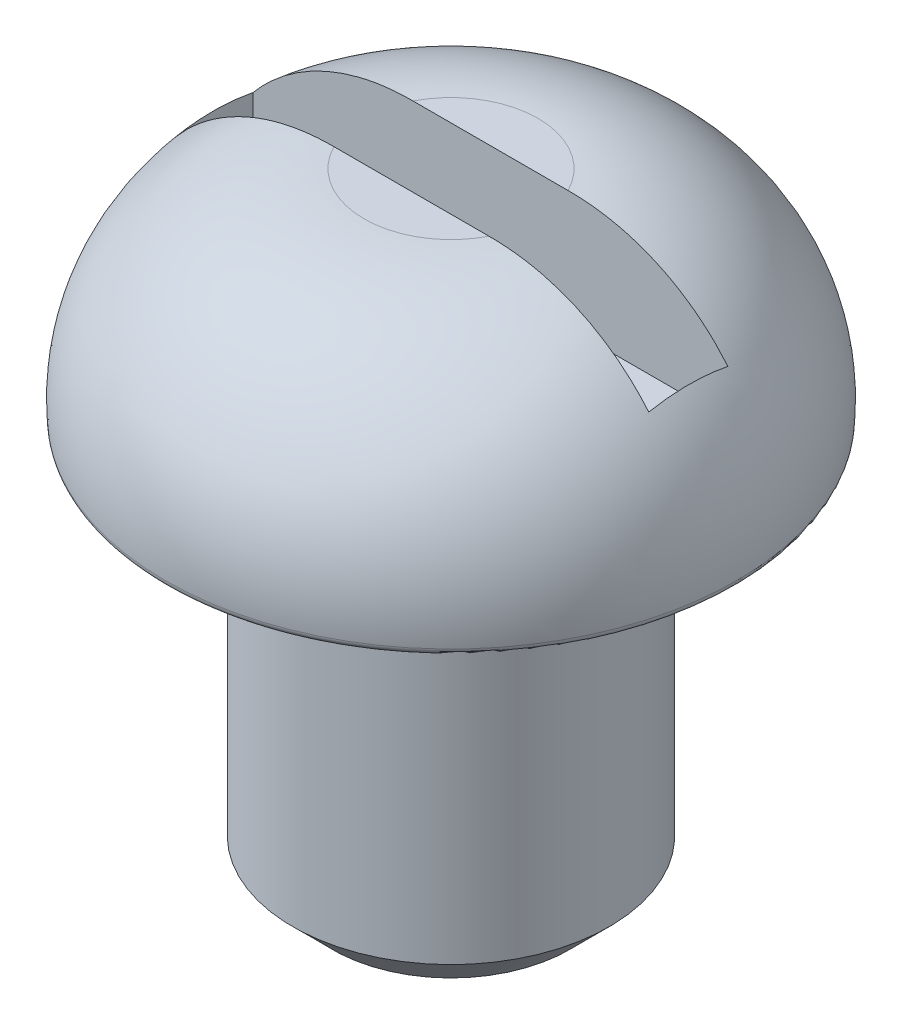
ISO-10303-21;
HEADER;
FILE_DESCRIPTION(('STEP AP214'),'2;1');
FILE_NAME('part.step','',(''),(''),'','','');
FILE_SCHEMA(('AUTOMOTIVE_DESIGN { 1 0 10303 214 1 1 1 1 }'));
ENDSEC;
DATA;
#1=APPLICATION_CONTEXT('core data for automotive mechanical design processes');
#2=APPLICATION_PROTOCOL_DEFINITION('international standard','automotive_design',2000,#1);
#3=PRODUCT_CONTEXT('',#1,'mechanical');
#4=PRODUCT('Part','Part','',(#3));
#5=PRODUCT_RELATED_PRODUCT_CATEGORY('part','',(#4));
#6=PRODUCT_DEFINITION_FORMATION('','',#4);
#7=PRODUCT_DEFINITION_CONTEXT('part definition',#1,'design');
#8=PRODUCT_DEFINITION('design','',#6,#7);
#9=PRODUCT_DEFINITION_SHAPE('','',#8);
#10=(LENGTH_UNIT() NAMED_UNIT(*) SI_UNIT(.MILLI.,.METRE.));
#11=(NAMED_UNIT(*) PLANE_ANGLE_UNIT() SI_UNIT($,.RADIAN.));
#12=(NAMED_UNIT(*) SI_UNIT($,.STERADIAN.) SOLID_ANGLE_UNIT());
#13=UNCERTAINTY_MEASURE_WITH_UNIT(LENGTH_MEASURE(1.E-05),#10,'distance_accuracy_value','');
#14=(GEOMETRIC_REPRESENTATION_CONTEXT(3) GLOBAL_UNCERTAINTY_ASSIGNED_CONTEXT((#13)) GLOBAL_UNIT_ASSIGNED_CONTEXT((#10,
#11,#12)) REPRESENTATION_CONTEXT('',''));
#15=CARTESIAN_POINT('',(0.,0.,0.));
#16=DIRECTION('',(0.,0.,1.));
#17=DIRECTION('',(1.,0.,0.));
#18=AXIS2_PLACEMENT_3D('',#15,#16,#17);
#19=CARTESIAN_POINT('',(0.,7.8,0.));
#20=DIRECTION('',(0.,1.,0.));
#21=DIRECTION('',(0.,0.,1.));
#22=AXIS2_PLACEMENT_3D('',#19,#20,#21);
#23=PLANE('',#22);
#24=DIRECTION('',(-1.,0.,0.));
#25=VECTOR('',#24,1.);
#26=CARTESIAN_POINT('',(-3.,7.8,-0.499999999999999));
#27=LINE('',#26,#25);
#28=CARTESIAN_POINT('',(0.979795897113272,7.8,-0.5));
#29=VERTEX_POINT('',#28);
#30=CARTESIAN_POINT('',(-0.979795897113272,7.8,-0.5));
#31=VERTEX_POINT('',#30);
#32=EDGE_CURVE('E105',#29,#31,#27,.T.);
#33=ORIENTED_EDGE('',*,*,#32,.F.);
#34=CARTESIAN_POINT('',(0.,7.8,0.));
#35=DIRECTION('',(0.,-1.,0.));
#36=DIRECTION('',(0.,0.,-1.));
#37=AXIS2_PLACEMENT_3D('',#34,#35,#36);
#38=CIRCLE('',#37,1.1);
#39=EDGE_CURVE('E128',#31,#29,#38,.T.);
#40=ORIENTED_EDGE('',*,*,#39,.F.);
#41=EDGE_LOOP('',(#33,#40));
#42=FACE_BOUND('',#41,.T.);
#43=ADVANCED_FACE('F29',(#42),#23,.T.);
#44=CARTESIAN_POINT('',(1.5,0.,0.));
#45=DIRECTION('',(0.,-1.,0.));
#46=DIRECTION('',(0.,0.,-1.));
#47=AXIS2_PLACEMENT_3D('',#44,#45,#46);
#48=PLANE('',#47);
#49=CARTESIAN_POINT('',(0.,0.,0.));
#50=DIRECTION('',(0.,-1.,0.));
#51=DIRECTION('',(0.,0.,-1.));
#52=AXIS2_PLACEMENT_3D('',#49,#50,#51);
#53=CIRCLE('',#52,1.5);
#54=CARTESIAN_POINT('',(0.,0.,-1.5));
#55=VERTEX_POINT('',#54);
#56=EDGE_CURVE('E115',#55,#55,#53,.T.);
#57=ORIENTED_EDGE('',*,*,#56,.T.);
#58=EDGE_LOOP('',(#57));
#59=FACE_BOUND('',#58,.T.);
#60=ADVANCED_FACE('F31',(#59),#48,.T.);
#61=DIRECTION('',(1.,0.,0.));
#62=VECTOR('',#61,1.);
#63=CARTESIAN_POINT('',(-3.,7.8,0.5));
#64=LINE('',#63,#62);
#65=CARTESIAN_POINT('',(-0.979795897113272,7.8,0.5));
#66=VERTEX_POINT('',#65);
#67=CARTESIAN_POINT('',(0.979795897113272,7.8,0.5));
#68=VERTEX_POINT('',#67);
#69=EDGE_CURVE('E107',#66,#68,#64,.T.);
#70=ORIENTED_EDGE('',*,*,#69,.F.);
#71=EDGE_CURVE('E131',#68,#66,#38,.T.);
#72=ORIENTED_EDGE('',*,*,#71,.F.);
#73=EDGE_LOOP('',(#70,#72));
#74=FACE_BOUND('',#73,.T.);
#75=ADVANCED_FACE('F176',(#74),#23,.T.);
#76=CARTESIAN_POINT('',(0.,5.28392857142857,0.));
#77=DIRECTION('',(0.,-1.,0.));
#78=DIRECTION('',(0.,0.,-1.));
#79=AXIS2_PLACEMENT_3D('',#76,#77,#78);
#80=DEGENERATE_TOROIDAL_SURFACE('',#79,1.1,2.51607142857143,.T.);
#81=CARTESIAN_POINT('',(0.,7.72741285287453,-0.5));
#82=CARTESIAN_POINT('',(-0.042281839216798,7.72741654693849,-0.5));
#83=CARTESIAN_POINT('',(-0.0845648077539234,7.72877327592071,-0.5));
#84=CARTESIAN_POINT('',(-0.16903295112575,7.73371678296004,-0.5));
#85=CARTESIAN_POINT('',(-0.211217957322735,7.73730612669833,-0.5));
#86=CARTESIAN_POINT('',(-0.295732319609198,7.74568730123717,-0.5));
#87=CARTESIAN_POINT('',(-0.338060855781322,7.75048672709458,-0.5));
#88=CARTESIAN_POINT('',(-0.42268796162483,7.76026727094819,-0.5));
#89=CARTESIAN_POINT('',(-0.464986535283327,7.7652483565223,-0.5));
#90=CARTESIAN_POINT('',(-0.549995859987487,7.77469082090246,-0.5));
#91=CARTESIAN_POINT('',(-0.592707150305704,7.77914761083377,-0.5));
#92=CARTESIAN_POINT('',(-0.678226998569677,7.78698758227835,-0.5));
#93=CARTESIAN_POINT('',(-0.721035552525858,7.79037080705423,-0.5));
#94=CARTESIAN_POINT('',(-0.84958950567168,7.79837652375647,-0.5));
#95=CARTESIAN_POINT('',(-0.935489790921104,7.80085850297676,-0.5));
#96=CARTESIAN_POINT('',(-1.1067831178282,7.7985979859046,-0.5));
#97=CARTESIAN_POINT('',(-1.19217649378594,7.7938926243803,-0.5));
#98=CARTESIAN_POINT('',(-1.36218346820903,7.7767110644375,-0.5));
#99=CARTESIAN_POINT('',(-1.44679694829237,7.76423370538063,-0.5));
#100=CARTESIAN_POINT('',(-1.67247179942634,7.71978857872035,-0.5));
#101=CARTESIAN_POINT('',(-1.81214349732275,7.68031086977517,-0.5));
#102=CARTESIAN_POINT('',(-2.08327243273732,7.578365307995,-0.5));
#103=CARTESIAN_POINT('',(-2.21470455040019,7.51583080489117,-0.5));
#104=CARTESIAN_POINT('',(-2.46503915559689,7.36922411758531,-0.5));
#105=CARTESIAN_POINT('',(-2.5839377708626,7.28514530456096,-0.499999999999999));
#106=CARTESIAN_POINT('',(-2.80538188060228,7.09787399130033,-0.499999999999999));
#107=CARTESIAN_POINT('',(-2.90794452018514,6.99470177942185,-0.499999999999999));
#108=CARTESIAN_POINT('',(-3.09164169034083,6.77468570273218,-0.499999999999999));
#109=CARTESIAN_POINT('',(-3.17320287222632,6.6581978139942,-0.499999999999999));
#110=CARTESIAN_POINT('',(-3.31544644584769,6.41305955169074,-0.499999999999999));
#111=CARTESIAN_POINT('',(-3.37612390334343,6.28440631293368,-0.499999999999999));
#112=CARTESIAN_POINT('',(-3.47437212103018,6.01976923720552,-0.499999999999999));
#113=CARTESIAN_POINT('',(-3.5121288252665,5.88385439630765,-0.499999999999999));
#114=CARTESIAN_POINT('',(-3.56421697913353,5.60762139502178,-0.499999999999999));
#115=CARTESIAN_POINT('',(-3.57855112578794,5.46730374349831,-0.499999999999999));
#116=CARTESIAN_POINT('',(-3.58337884124122,5.18663409871116,-0.499999999999999));
#117=CARTESIAN_POINT('',(-3.57393572471911,5.04628318963348,-0.499999999999999));
#118=CARTESIAN_POINT('',(-3.5316141639522,4.76915049513042,-0.499999999999999));
#119=CARTESIAN_POINT('',(-3.498734095655,4.63236895772385,-0.499999999999999));
#120=CARTESIAN_POINT('',(-3.41049285796513,4.36628210405101,-0.499999999999999));
#121=CARTESIAN_POINT('',(-3.35513462872845,4.23697581254436,-0.499999999999999));
#122=CARTESIAN_POINT('',(-3.22354867158706,3.98949328322027,-0.499999999999999));
#123=CARTESIAN_POINT('',(-3.14732499631139,3.87131489005098,-0.499999999999999));
#124=CARTESIAN_POINT('',(-2.97603829937548,3.64915027308459,-0.499999999999999));
#125=CARTESIAN_POINT('',(-2.88093963719999,3.54519153648646,-0.499999999999999));
#126=CARTESIAN_POINT('',(-2.67467710760851,3.35454114342512,-0.499999999999999));
#127=CARTESIAN_POINT('',(-2.56350398798273,3.26785950020401,-0.5));
#128=CARTESIAN_POINT('',(-2.32755014511485,3.11360464345636,-0.5));
#129=CARTESIAN_POINT('',(-2.20268187759651,3.04616563243585,-0.5));
#130=CARTESIAN_POINT('',(-1.94368132676,2.93287698782177,-0.5));
#131=CARTESIAN_POINT('',(-1.80956257964428,2.8869965452354,-0.5));
#132=CARTESIAN_POINT('',(-1.60298474041263,2.83440882031757,-0.5));
#133=CARTESIAN_POINT('',(-1.53249789321917,2.81952122194781,-0.5));
#134=CARTESIAN_POINT('',(-1.39052442675912,2.79540495059233,-0.5));
#135=CARTESIAN_POINT('',(-1.31903748046251,2.78617817511717,-0.5));
#136=CARTESIAN_POINT('',(-1.17546901496845,2.77320390137064,-0.5));
#137=CARTESIAN_POINT('',(-1.10338674206885,2.76946497528775,-0.5));
#138=CARTESIAN_POINT('',(-0.959208808371293,2.76709451049406,-0.5));
#139=CARTESIAN_POINT('',(-0.887113210022953,2.76845867124155,-0.5));
#140=CARTESIAN_POINT('',(-0.775214024066888,2.77391123282925,-0.5));
#141=CARTESIAN_POINT('',(-0.735327198974333,2.77651597691304,-0.5));
#142=CARTESIAN_POINT('',(-0.655638244781422,2.78280735406635,-0.5));
#143=CARTESIAN_POINT('',(-0.615836118302234,2.78649402014144,-0.5));
#144=CARTESIAN_POINT('',(-0.536263508131233,2.79462144719698,-0.5));
#145=CARTESIAN_POINT('',(-0.496493120648777,2.79906311317887,-0.5));
#146=CARTESIAN_POINT('',(-0.416975805224196,2.80820548790677,-0.5));
#147=CARTESIAN_POINT('',(-0.377228883093885,2.81290624516751,-0.5));
#148=CARTESIAN_POINT('',(-0.297586444851776,2.82187883252253,-0.5));
#149=CARTESIAN_POINT('',(-0.257690801820812,2.82614959807181,-0.5));
#150=CARTESIAN_POINT('',(-0.17778391007266,2.83335474877311,-0.5));
#151=CARTESIAN_POINT('',(-0.137772712092004,2.83628965066493,-0.5));
#152=CARTESIAN_POINT('',(-0.0577077415049983,2.83999017238346,-0.5));
#153=CARTESIAN_POINT('',(-0.0176541585425324,2.84075949122909,-0.5));
#154=CARTESIAN_POINT('',(0.0624280292990336,2.83988319172582,-0.5));
#155=CARTESIAN_POINT('',(0.102456631415337,2.83823734184884,-0.5));
#156=CARTESIAN_POINT('',(0.200234845544319,2.83189818281024,-0.5));
#157=CARTESIAN_POINT('',(0.257909097546064,2.826171639196,-0.5));
#158=CARTESIAN_POINT('',(0.373130582436596,2.81349379269113,-0.5));
#159=CARTESIAN_POINT('',(0.430677721845475,2.80654177881028,-0.5));
#160=CARTESIAN_POINT('',(0.546015792537372,2.79352048271878,-0.5));
#161=CARTESIAN_POINT('',(0.603806980698212,2.78745323987419,-0.5));
#162=CARTESIAN_POINT('',(0.719564756314968,2.77745828343069,-0.5));
#163=CARTESIAN_POINT('',(0.777531278219117,2.77352985070593,-0.5));
#164=CARTESIAN_POINT('',(0.893172400195654,2.76854275544782,-0.5));
#165=CARTESIAN_POINT('',(0.950846012476757,2.76746320269116,-0.5));
#166=CARTESIAN_POINT('',(1.06616353736375,2.76851252292201,-0.5));
#167=CARTESIAN_POINT('',(1.12380744653327,2.77064170814559,-0.5));
#168=CARTESIAN_POINT('',(1.29646264418288,2.78223867600054,-0.5));
#169=CARTESIAN_POINT('',(1.41119794735551,2.79691584185622,-0.5));
#170=CARTESIAN_POINT('',(1.59489926285845,2.83261559149393,-0.5));
#171=CARTESIAN_POINT('',(1.66477164806265,2.84914222822955,-0.5));
#172=CARTESIAN_POINT('',(1.80287380943863,2.88784500339178,-0.5));
#173=CARTESIAN_POINT('',(1.8711047501223,2.91001699914347,-0.5));
#174=CARTESIAN_POINT('',(2.07410752672873,2.98549592029451,-0.5));
#175=CARTESIAN_POINT('',(2.20577330597763,3.04749461160393,-0.5));
#176=CARTESIAN_POINT('',(2.45633142382588,3.19288225773033,-0.5));
#177=CARTESIAN_POINT('',(2.57524579148441,3.27623345148029,-0.5));
#178=CARTESIAN_POINT('',(2.79655315203983,3.46171351618865,-0.5));
#179=CARTESIAN_POINT('',(2.89901563927389,3.56375928253145,-0.5));
#180=CARTESIAN_POINT('',(3.08333361106216,3.78206180281883,-0.5));
#181=CARTESIAN_POINT('',(3.16550705350707,3.89805031237572,-0.5));
#182=CARTESIAN_POINT('',(3.30914359276284,4.14243512151084,-0.5));
#183=CARTESIAN_POINT('',(3.37057811060937,4.2708482318365,-0.5));
#184=CARTESIAN_POINT('',(3.47032106842233,4.53507437796322,-0.5));
#185=CARTESIAN_POINT('',(3.50882693864908,4.67081292873242,-0.5));
#186=CARTESIAN_POINT('',(3.562418994764,4.94677909958349,-0.5));
#187=CARTESIAN_POINT('',(3.5775152322762,5.08700476657572,-0.5));
#188=CARTESIAN_POINT('',(3.58387202437275,5.36763441034358,-0.5));
#189=CARTESIAN_POINT('',(3.57519350318312,5.5080370115194,-0.5));
#190=CARTESIAN_POINT('',(3.53438074581866,5.78540180537421,-0.5));
#191=CARTESIAN_POINT('',(3.50224468403048,5.92236372941982,-0.5));
#192=CARTESIAN_POINT('',(3.41545623121341,6.18891178477867,-0.5));
#193=CARTESIAN_POINT('',(3.36081037331555,6.31850004377765,-0.5));
#194=CARTESIAN_POINT('',(3.23057736221933,6.56669297613497,-0.5));
#195=CARTESIAN_POINT('',(3.15498920043748,6.68529712013004,-0.5));
#196=CARTESIAN_POINT('',(2.98487308180983,6.90843444683799,-0.5));
#197=CARTESIAN_POINT('',(2.89030540717657,7.01293734029921,-0.5));
#198=CARTESIAN_POINT('',(2.68507678186927,7.20467666265842,-0.5));
#199=CARTESIAN_POINT('',(2.57441856634329,7.29191602015743,-0.5));
#200=CARTESIAN_POINT('',(2.33946571548052,7.44732744855812,-0.5));
#201=CARTESIAN_POINT('',(2.21509014848476,7.51537689733444,-0.5));
#202=CARTESIAN_POINT('',(1.95675563445144,7.63006319207496,-0.5));
#203=CARTESIAN_POINT('',(1.82279463260219,7.67669543088194,-0.5));
#204=CARTESIAN_POINT('',(1.61639044375142,7.73038764423974,-0.5));
#205=CARTESIAN_POINT('',(1.54596802681153,7.74564158709015,-0.5));
#206=CARTESIAN_POINT('',(1.40410609749613,7.77048002201432,-0.5));
#207=CARTESIAN_POINT('',(1.33266644460989,7.78006372292354,-0.5));
#208=CARTESIAN_POINT('',(1.18926106846354,7.79372391525551,-0.5));
#209=CARTESIAN_POINT('',(1.11729524330598,7.79779930993727,-0.5));
#210=CARTESIAN_POINT('',(0.973303073568271,7.8008297297292,-0.5));
#211=CARTESIAN_POINT('',(0.901276777340396,7.79978731790852,-0.5));
#212=CARTESIAN_POINT('',(0.759833351892086,7.79343428096995,-0.5));
#213=CARTESIAN_POINT('',(0.690409077868159,7.78826668745101,-0.5));
#214=CARTESIAN_POINT('',(0.586441263183594,7.77846298930097,-0.5));
#215=CARTESIAN_POINT('',(0.551792076389232,7.77485017189743,-0.5));
#216=CARTESIAN_POINT('',(0.482536872530973,7.76722779086835,-0.5));
#217=CARTESIAN_POINT('',(0.447930856213369,7.76321822047776,-0.5));
#218=CARTESIAN_POINT('',(0.378954746753072,7.7552063552449,-0.5));
#219=CARTESIAN_POINT('',(0.344584635203559,7.75120419343899,-0.5));
#220=CARTESIAN_POINT('',(0.27578898800155,7.7436731451844,-0.5));
#221=CARTESIAN_POINT('',(0.241363450768215,7.74014427248575,-0.5));
#222=CARTESIAN_POINT('',(0.172485362325034,7.7341476882484,-0.5));
#223=CARTESIAN_POINT('',(0.138033012391917,7.73167780854752,-0.5));
#224=CARTESIAN_POINT('',(0.0690540126144134,7.72830907324241,-0.5));
#225=CARTESIAN_POINT('',(0.0345273828434016,7.72740983629902,-0.5));
#226=CARTESIAN_POINT('',(0.,7.72741285287453,-0.5));
#227=B_SPLINE_CURVE_WITH_KNOTS('',3,(#81,#82,#83,#84,#85,#86,#87,#88,#89,#90,#91,#92,#93,#94,
#95,#96,#97,#98,#99,#100,#101,#102,#103,#104,#105,#106,#107,#108,#109,#110,#111,#112,#113,#114,
#115,#116,#117,#118,#119,#120,#121,#122,#123,#124,#125,#126,#127,#128,#129,#130,#131,#132,#133,
#134,#135,#136,#137,#138,#139,#140,#141,#142,#143,#144,#145,#146,#147,#148,#149,#150,#151,#152,
#153,#154,#155,#156,#157,#158,#159,#160,#161,#162,#163,#164,#165,#166,#167,#168,#169,#170,#171,
#172,#173,#174,#175,#176,#177,#178,#179,#180,#181,#182,#183,#184,#185,#186,#187,#188,#189,#190,
#191,#192,#193,#194,#195,#196,#197,#198,#199,#200,#201,#202,#203,#204,#205,#206,#207,#208,#209,
#210,#211,#212,#213,#214,#215,#216,#217,#218,#219,#220,#221,#222,#223,#224,#225,#226),
.UNSPECIFIED.,.T.,.F.,(4,2,2,2,2,2,2,2,2,2,2,2,2,2,2,2,2,2,2,2,2,2,2,2,2,2,2,2,2,2,2,2,2,2,2,2,
2,2,2,2,2,2,2,2,2,2,2,2,2,2,2,2,2,2,2,2,2,2,2,2,2,2,2,2,2,2,2,2,2,2,2,2,4),(0.,
0.126832445010955,0.253810913582559,0.381607112858121,0.509380614001818,0.638200232580602,
0.767014659317311,1.02456319614758,1.28078555308018,1.53704618238923,1.97035679177588,
2.40492991997873,2.83963691992652,3.27388463166759,3.69845356976823,4.12312275288421,
4.54429910250408,4.96542695175598,5.38543459801147,5.80547135132612,6.22545318128816,
6.64535349732551,7.06605436134675,7.48699834543456,7.91081008137102,8.33401429898667,
8.54994817728238,8.76595439722896,8.9822976677333,9.19845865962705,9.31836039848569,
9.43826579549813,9.55831594725931,9.67838865524539,9.79875167646172,9.91906809911172,
10.0391788849595,10.1593011858772,10.3331086877597,10.507017362734,10.6813207613517,
10.8555655181996,11.0285289789845,11.2015092715958,11.5474682304916,11.7626498055027,
11.9776739288769,12.4119939426601,12.8455511178588,13.2772257761513,13.7016312130657,
14.1266191306346,14.547892631159,14.968985195205,15.3889996947157,15.8090468858825,
16.2289722504485,16.6489178421799,17.0697515792289,17.4905138643667,17.9139068279665,
18.3373908270173,18.5533648573046,18.7693690151815,18.9854161746131,19.2013551456427,
19.4101160847006,19.5146257294316,19.6191371564655,19.7229443364761,19.8267545316491,
19.9303511609617,20.0339226343643),.UNSPECIFIED.);
#228=CARTESIAN_POINT('',(3.,6.88444543075919,-0.5));
#229=VERTEX_POINT('',#228);
#230=EDGE_CURVE('E11',#229,#29,#227,.T.);
#231=ORIENTED_EDGE('',*,*,#230,.F.);
#232=CARTESIAN_POINT('',(3.,6.93335739186111,0.));
#233=CARTESIAN_POINT('',(3.,6.93336461310188,-0.154184867381827));
#234=CARTESIAN_POINT('',(3.,6.9197293123384,-0.308634480967941));
#235=CARTESIAN_POINT('',(3.,6.86418031338909,-0.612738389217278));
#236=CARTESIAN_POINT('',(3.,6.82222092261654,-0.762384525623875));
#237=CARTESIAN_POINT('',(3.,6.72526504634106,-1.00661273643669));
#238=CARTESIAN_POINT('',(3.,6.67795204285815,-1.10424950305777));
#239=CARTESIAN_POINT('',(3.,6.56812874673176,-1.29045349555034));
#240=CARTESIAN_POINT('',(3.,6.50565260783125,-1.37904047693242));
#241=CARTESIAN_POINT('',(3.,6.37642763604719,-1.53098505261685));
#242=CARTESIAN_POINT('',(3.,6.31178499758491,-1.59612980062483));
#243=CARTESIAN_POINT('',(3.,6.17252784832791,-1.71483755019827));
#244=CARTESIAN_POINT('',(3.,6.09791362605457,-1.7684008867471));
#245=CARTESIAN_POINT('',(3.,5.9398692815416,-1.86168486276998));
#246=CARTESIAN_POINT('',(3.,5.85639334468504,-1.9013284970785));
#247=CARTESIAN_POINT('',(3.,5.68345548001443,-1.96417971442271));
#248=CARTESIAN_POINT('',(3.,5.59399675278274,-1.98739600973284));
#249=CARTESIAN_POINT('',(3.,5.42161625631113,-2.01456662623953));
#250=CARTESIAN_POINT('',(3.,5.33896414326272,-2.0202511606809));
#251=CARTESIAN_POINT('',(3.,5.17396136136139,-2.01701940234604));
#252=CARTESIAN_POINT('',(3.,5.09161060386738,-2.0081078190201));
#253=CARTESIAN_POINT('',(3.,4.93300956772154,-1.97678912412979));
#254=CARTESIAN_POINT('',(3.,4.85664726495929,-1.95494243069133));
#255=CARTESIAN_POINT('',(3.,4.70847862984289,-1.89919651953525));
#256=CARTESIAN_POINT('',(3.,4.63667257392385,-1.86529657134894));
#257=CARTESIAN_POINT('',(3.,4.49655995404805,-1.78530449862206));
#258=CARTESIAN_POINT('',(3.,4.42849253275642,-1.73879537527413));
#259=CARTESIAN_POINT('',(3.,4.30018735152327,-1.63603856746414));
#260=CARTESIAN_POINT('',(3.,4.23995223263282,-1.5797876128911));
#261=CARTESIAN_POINT('',(3.,4.1220309802308,-1.45293717811816));
#262=CARTESIAN_POINT('',(3.,4.06530665862844,-1.3814465069673));
#263=CARTESIAN_POINT('',(3.,3.96265526497357,-1.23112499349274));
#264=CARTESIAN_POINT('',(3.,3.91673383716525,-1.15229034401645));
#265=CARTESIAN_POINT('',(3.,3.82875737127663,-0.975617614991071));
#266=CARTESIAN_POINT('',(3.,3.78864932271281,-0.876812512176412));
#267=CARTESIAN_POINT('',(3.,3.72245308968346,-0.674638460242954));
#268=CARTESIAN_POINT('',(3.,3.69637374778571,-0.571266676967369));
#269=CARTESIAN_POINT('',(3.,3.6536975094114,-0.340828407679238));
#270=CARTESIAN_POINT('',(3.,3.64009224889631,-0.213204469845908));
#271=CARTESIAN_POINT('',(3.,3.63169621338285,0.0427984108447429));
#272=CARTESIAN_POINT('',(3.,3.63693331736424,0.171178191636854));
#273=CARTESIAN_POINT('',(3.,3.66847011687393,0.442720920924669));
#274=CARTESIAN_POINT('',(3.,3.69747296739361,0.585584555395529));
#275=CARTESIAN_POINT('',(3.,3.78140978260965,0.863438437540755));
#276=CARTESIAN_POINT('',(3.,3.83628764493806,0.998445012889438));
#277=CARTESIAN_POINT('',(3.,3.95245676424918,1.21509293732962));
#278=CARTESIAN_POINT('',(3.,4.00675082641463,1.3004978897973));
#279=CARTESIAN_POINT('',(3.,4.12857283936112,1.46135850667192));
#280=CARTESIAN_POINT('',(3.,4.19609339333045,1.5368196927775));
#281=CARTESIAN_POINT('',(3.,4.34420546062528,1.67504434566068));
#282=CARTESIAN_POINT('',(3.,4.42489660236604,1.73770211736695));
#283=CARTESIAN_POINT('',(3.,4.59701464073842,1.84603763329797));
#284=CARTESIAN_POINT('',(3.,4.68843313843661,1.89172854644452));
#285=CARTESIAN_POINT('',(3.,4.86596926658714,1.95838497974242));
#286=CARTESIAN_POINT('',(3.,4.95115367974155,1.98184459035223));
#287=CARTESIAN_POINT('',(3.,5.12438427971692,2.01256302199119));
#288=CARTESIAN_POINT('',(3.,5.21242861197037,2.01983213735679));
#289=CARTESIAN_POINT('',(3.,5.38043615698326,2.01787478754687));
#290=CARTESIAN_POINT('',(3.,5.46041959931175,2.01006202839145));
#291=CARTESIAN_POINT('',(3.,5.6179061731293,1.9810650617856));
#292=CARTESIAN_POINT('',(3.,5.69540966463317,1.9598828045252));
#293=CARTESIAN_POINT('',(3.,5.84567445351992,1.90517607155327));
#294=CARTESIAN_POINT('',(3.,5.91844739026499,1.87168335157831));
#295=CARTESIAN_POINT('',(3.,6.05784039456533,1.79373433512546));
#296=CARTESIAN_POINT('',(3.,6.12445902653851,1.74927548946905));
#297=CARTESIAN_POINT('',(3.,6.25487134734268,1.64750728180445));
#298=CARTESIAN_POINT('',(3.,6.31812404124668,1.58950721373672));
#299=CARTESIAN_POINT('',(3.,6.43539516716216,1.46486839496236));
#300=CARTESIAN_POINT('',(3.,6.48941078608306,1.39822702342906));
#301=CARTESIAN_POINT('',(3.,6.59462527161511,1.24870293407758));
#302=CARTESIAN_POINT('',(3.,6.64443363165447,1.16484490536442));
#303=CARTESIAN_POINT('',(3.,6.73186070837906,0.990966421645666));
#304=CARTESIAN_POINT('',(3.,6.76946552499681,0.900939079994877));
#305=CARTESIAN_POINT('',(3.,6.83894291603379,0.699207880366169));
#306=CARTESIAN_POINT('',(3.,6.86833787364544,0.586655008454969));
#307=CARTESIAN_POINT('',(3.,6.91112455360347,0.358730572586323));
#308=CARTESIAN_POINT('',(3.,6.92453952921339,0.243363354188531));
#309=CARTESIAN_POINT('',(3.,6.93231181967244,0.0851859596883019));
#310=CARTESIAN_POINT('',(3.,6.93335539654763,0.0426030862879899));
#311=CARTESIAN_POINT('',(3.,6.93335739186111,0.));
#312=B_SPLINE_CURVE_WITH_KNOTS('',3,(#232,#233,#234,#235,#236,#237,#238,#239,#240,#241,#242,
#243,#244,#245,#246,#247,#248,#249,#250,#251,#252,#253,#254,#255,#256,#257,#258,#259,#260,#261,
#262,#263,#264,#265,#266,#267,#268,#269,#270,#271,#272,#273,#274,#275,#276,#277,#278,#279,#280,
#281,#282,#283,#284,#285,#286,#287,#288,#289,#290,#291,#292,#293,#294,#295,#296,#297,#298,#299,
#300,#301,#302,#303,#304,#305,#306,#307,#308,#309,#310,#311),.UNSPECIFIED.,.T.,.F.,(4,2,2,2,2,2,
2,2,2,2,2,2,2,2,2,2,2,2,2,2,2,2,2,2,2,2,2,2,2,2,2,2,2,2,2,2,2,2,2,4),(0.,0.462418793853954,
0.925585352802772,1.24985033038329,1.57339159717828,1.84756997016048,2.12174041168414,
2.39740454050721,2.67292236046499,2.92020383836321,3.16740554639014,3.40460893901155,
3.6418267094253,3.88812413472772,4.13450439728723,4.40723838781147,4.68011456016614,
4.9988530127053,5.31779213759774,5.70134864783785,6.08547289779954,6.52057767545824,
6.95474336411365,7.2571856094031,7.55945919664367,7.86413539925472,8.1685746289986,
8.43218694030348,8.6956315921638,8.93557458959559,9.17548259496344,9.41477603433159,
9.65412515220916,9.9105574888536,10.1670677817415,10.4585857025945,10.7504345118766,
11.0981845309878,11.4454279012428,11.5731996346838),.UNSPECIFIED.);
#313=CARTESIAN_POINT('',(3.,6.88444543075925,0.5));
#314=VERTEX_POINT('',#313);
#315=EDGE_CURVE('E33',#314,#229,#312,.T.);
#316=ORIENTED_EDGE('',*,*,#315,.F.);
#317=CARTESIAN_POINT('',(0.,7.72741285287453,0.5));
#318=CARTESIAN_POINT('',(0.0422818392167981,7.72741654693849,0.5));
#319=CARTESIAN_POINT('',(0.0845648077539235,7.72877327592071,0.5));
#320=CARTESIAN_POINT('',(0.16903295112575,7.73371678296004,0.5));
#321=CARTESIAN_POINT('',(0.211217957322735,7.73730612669833,0.5));
#322=CARTESIAN_POINT('',(0.295732319609198,7.74568730123717,0.5));
#323=CARTESIAN_POINT('',(0.338060855781322,7.75048672709458,0.5));
#324=CARTESIAN_POINT('',(0.42268796162483,7.76026727094819,0.5));
#325=CARTESIAN_POINT('',(0.464986535283327,7.7652483565223,0.5));
#326=CARTESIAN_POINT('',(0.549995859987488,7.77469082090246,0.5));
#327=CARTESIAN_POINT('',(0.592707150305704,7.77914761083377,0.5));
#328=CARTESIAN_POINT('',(0.678226998569676,7.78698758227835,0.5));
#329=CARTESIAN_POINT('',(0.721035552525858,7.79037080705423,0.5));
#330=CARTESIAN_POINT('',(0.84958950567168,7.79837652375647,0.5));
#331=CARTESIAN_POINT('',(0.935489790921104,7.80085850297676,0.5));
#332=CARTESIAN_POINT('',(1.1067831178282,7.7985979859046,0.5));
#333=CARTESIAN_POINT('',(1.19217649378594,7.7938926243803,0.5));
#334=CARTESIAN_POINT('',(1.36218346820903,7.7767110644375,0.5));
#335=CARTESIAN_POINT('',(1.44679694829237,7.76423370538063,0.5));
#336=CARTESIAN_POINT('',(1.67247179942634,7.71978857872035,0.5));
#337=CARTESIAN_POINT('',(1.81214349732275,7.68031086977517,0.5));
#338=CARTESIAN_POINT('',(2.08327243273732,7.578365307995,0.5));
#339=CARTESIAN_POINT('',(2.2147045504002,7.51583080489117,0.5));
#340=CARTESIAN_POINT('',(2.46503915559689,7.36922411758531,0.5));
#341=CARTESIAN_POINT('',(2.5839377708626,7.28514530456096,0.5));
#342=CARTESIAN_POINT('',(2.80538188060228,7.09787399130032,0.5));
#343=CARTESIAN_POINT('',(2.90794452018514,6.99470177942185,0.5));
#344=CARTESIAN_POINT('',(3.09164169034083,6.77468570273218,0.5));
#345=CARTESIAN_POINT('',(3.17320287222632,6.6581978139942,0.5));
#346=CARTESIAN_POINT('',(3.31544644584769,6.41305955169074,0.5));
#347=CARTESIAN_POINT('',(3.37612390334343,6.28440631293368,0.5));
#348=CARTESIAN_POINT('',(3.47437212103018,6.01976923720552,0.5));
#349=CARTESIAN_POINT('',(3.5121288252665,5.88385439630765,0.5));
#350=CARTESIAN_POINT('',(3.56421697913353,5.60762139502178,0.5));
#351=CARTESIAN_POINT('',(3.57855112578794,5.46730374349831,0.5));
#352=CARTESIAN_POINT('',(3.58337884124122,5.18663409871115,0.5));
#353=CARTESIAN_POINT('',(3.57393572471911,5.04628318963348,0.5));
#354=CARTESIAN_POINT('',(3.5316141639522,4.76915049513041,0.5));
#355=CARTESIAN_POINT('',(3.498734095655,4.63236895772384,0.5));
#356=CARTESIAN_POINT('',(3.41049285796513,4.36628210405101,0.5));
#357=CARTESIAN_POINT('',(3.35513462872845,4.23697581254436,0.5));
#358=CARTESIAN_POINT('',(3.22354867158706,3.98949328322026,0.5));
#359=CARTESIAN_POINT('',(3.14732499631139,3.87131489005098,0.5));
#360=CARTESIAN_POINT('',(2.97603829937548,3.64915027308459,0.5));
#361=CARTESIAN_POINT('',(2.88093963719998,3.54519153648645,0.5));
#362=CARTESIAN_POINT('',(2.67467710760851,3.35454114342512,0.5));
#363=CARTESIAN_POINT('',(2.56350398798273,3.26785950020401,0.5));
#364=CARTESIAN_POINT('',(2.32755014511485,3.11360464345636,0.5));
#365=CARTESIAN_POINT('',(2.20268187759651,3.04616563243585,0.5));
#366=CARTESIAN_POINT('',(1.94368132676,2.93287698782177,0.5));
#367=CARTESIAN_POINT('',(1.80956257964428,2.8869965452354,0.5));
#368=CARTESIAN_POINT('',(1.60298474041263,2.83440882031757,0.5));
#369=CARTESIAN_POINT('',(1.53249789321916,2.81952122194781,0.5));
#370=CARTESIAN_POINT('',(1.39052442675912,2.79540495059233,0.5));
#371=CARTESIAN_POINT('',(1.3190374804625,2.78617817511717,0.5));
#372=CARTESIAN_POINT('',(1.17546901496844,2.77320390137064,0.5));
#373=CARTESIAN_POINT('',(1.10338674206884,2.76946497528775,0.5));
#374=CARTESIAN_POINT('',(0.95920880837129,2.76709451049406,0.5));
#375=CARTESIAN_POINT('',(0.88711321002295,2.76845867124155,0.5));
#376=CARTESIAN_POINT('',(0.775214024066885,2.77391123282925,0.5));
#377=CARTESIAN_POINT('',(0.735327198974331,2.77651597691304,0.5));
#378=CARTESIAN_POINT('',(0.655638244781419,2.78280735406635,0.5));
#379=CARTESIAN_POINT('',(0.615836118302231,2.78649402014144,0.5));
#380=CARTESIAN_POINT('',(0.536263508131229,2.79462144719698,0.5));
#381=CARTESIAN_POINT('',(0.496493120648773,2.79906311317887,0.5));
#382=CARTESIAN_POINT('',(0.416975805224192,2.80820548790677,0.5));
#383=CARTESIAN_POINT('',(0.377228883093881,2.81290624516751,0.5));
#384=CARTESIAN_POINT('',(0.297586444851772,2.82187883252253,0.5));
#385=CARTESIAN_POINT('',(0.257690801820809,2.82614959807181,0.5));
#386=CARTESIAN_POINT('',(0.177783910072657,2.83335474877311,0.5));
#387=CARTESIAN_POINT('',(0.137772712092001,2.83628965066493,0.5));
#388=CARTESIAN_POINT('',(0.0577077415049952,2.83999017238346,0.5));
#389=CARTESIAN_POINT('',(0.01765415854253,2.84075949122909,0.5));
#390=CARTESIAN_POINT('',(-0.062428029299036,2.83988319172582,0.5));
#391=CARTESIAN_POINT('',(-0.10245663141534,2.83823734184884,0.5));
#392=CARTESIAN_POINT('',(-0.200234845544323,2.83189818281024,0.5));
#393=CARTESIAN_POINT('',(-0.257909097546068,2.826171639196,0.5));
#394=CARTESIAN_POINT('',(-0.373130582436599,2.81349379269112,0.5));
#395=CARTESIAN_POINT('',(-0.430677721845477,2.80654177881028,0.5));
#396=CARTESIAN_POINT('',(-0.546015792537373,2.79352048271878,0.5));
#397=CARTESIAN_POINT('',(-0.603806980698212,2.78745323987419,0.5));
#398=CARTESIAN_POINT('',(-0.719564756314968,2.77745828343069,0.5));
#399=CARTESIAN_POINT('',(-0.777531278219117,2.77352985070593,0.5));
#400=CARTESIAN_POINT('',(-0.893172400195654,2.76854275544782,0.5));
#401=CARTESIAN_POINT('',(-0.950846012476755,2.76746320269116,0.5));
#402=CARTESIAN_POINT('',(-1.06616353736375,2.76851252292201,0.5));
#403=CARTESIAN_POINT('',(-1.12380744653326,2.77064170814559,0.5));
#404=CARTESIAN_POINT('',(-1.29646264418287,2.78223867600054,0.5));
#405=CARTESIAN_POINT('',(-1.4111979473555,2.79691584185622,0.5));
#406=CARTESIAN_POINT('',(-1.59489926285844,2.83261559149393,0.5));
#407=CARTESIAN_POINT('',(-1.66477164806264,2.84914222822954,0.5));
#408=CARTESIAN_POINT('',(-1.80287380943863,2.88784500339178,0.5));
#409=CARTESIAN_POINT('',(-1.8711047501223,2.91001699914347,0.5));
#410=CARTESIAN_POINT('',(-2.07410752672873,2.98549592029451,0.5));
#411=CARTESIAN_POINT('',(-2.20577330597762,3.04749461160393,0.5));
#412=CARTESIAN_POINT('',(-2.45633142382588,3.19288225773033,0.5));
#413=CARTESIAN_POINT('',(-2.5752457914844,3.27623345148029,0.5));
#414=CARTESIAN_POINT('',(-2.79655315203982,3.46171351618864,0.5));
#415=CARTESIAN_POINT('',(-2.89901563927389,3.56375928253144,0.5));
#416=CARTESIAN_POINT('',(-3.08333361106216,3.78206180281882,0.5));
#417=CARTESIAN_POINT('',(-3.16550705350707,3.89805031237571,0.5));
#418=CARTESIAN_POINT('',(-3.30914359276283,4.14243512151083,0.5));
#419=CARTESIAN_POINT('',(-3.37057811060937,4.27084823183649,0.5));
#420=CARTESIAN_POINT('',(-3.47032106842233,4.53507437796322,0.5));
#421=CARTESIAN_POINT('',(-3.50882693864908,4.67081292873242,0.500000000000001));
#422=CARTESIAN_POINT('',(-3.562418994764,4.94677909958349,0.500000000000001));
#423=CARTESIAN_POINT('',(-3.5775152322762,5.08700476657572,0.500000000000001));
#424=CARTESIAN_POINT('',(-3.58387202437275,5.36763441034357,0.500000000000001));
#425=CARTESIAN_POINT('',(-3.57519350318312,5.50803701151939,0.500000000000001));
#426=CARTESIAN_POINT('',(-3.53438074581866,5.7854018053742,0.500000000000001));
#427=CARTESIAN_POINT('',(-3.50224468403048,5.92236372941981,0.5));
#428=CARTESIAN_POINT('',(-3.41545623121342,6.18891178477867,0.5));
#429=CARTESIAN_POINT('',(-3.36081037331555,6.31850004377764,0.5));
#430=CARTESIAN_POINT('',(-3.23057736221934,6.56669297613496,0.5));
#431=CARTESIAN_POINT('',(-3.15498920043748,6.68529712013004,0.5));
#432=CARTESIAN_POINT('',(-2.98487308180984,6.90843444683799,0.5));
#433=CARTESIAN_POINT('',(-2.89030540717658,7.01293734029921,0.5));
#434=CARTESIAN_POINT('',(-2.68507678186927,7.20467666265842,0.5));
#435=CARTESIAN_POINT('',(-2.5744185663433,7.29191602015743,0.5));
#436=CARTESIAN_POINT('',(-2.33946571548053,7.44732744855812,0.5));
#437=CARTESIAN_POINT('',(-2.21509014848477,7.51537689733444,0.5));
#438=CARTESIAN_POINT('',(-1.95675563445144,7.63006319207496,0.5));
#439=CARTESIAN_POINT('',(-1.8227946326022,7.67669543088194,0.5));
#440=CARTESIAN_POINT('',(-1.61639044375143,7.73038764423974,0.5));
#441=CARTESIAN_POINT('',(-1.54596802681154,7.74564158709015,0.5));
#442=CARTESIAN_POINT('',(-1.40410609749614,7.77048002201431,0.5));
#443=CARTESIAN_POINT('',(-1.33266644460989,7.78006372292354,0.5));
#444=CARTESIAN_POINT('',(-1.18926106846354,7.79372391525551,0.5));
#445=CARTESIAN_POINT('',(-1.11729524330599,7.79779930993727,0.5));
#446=CARTESIAN_POINT('',(-0.973303073568274,7.8008297297292,0.5));
#447=CARTESIAN_POINT('',(-0.901276777340401,7.79978731790852,0.5));
#448=CARTESIAN_POINT('',(-0.759833351892093,7.79343428096995,0.5));
#449=CARTESIAN_POINT('',(-0.690409077868167,7.78826668745101,0.5));
#450=CARTESIAN_POINT('',(-0.586441263183601,7.77846298930097,0.5));
#451=CARTESIAN_POINT('',(-0.551792076389237,7.77485017189743,0.5));
#452=CARTESIAN_POINT('',(-0.482536872530977,7.76722779086835,0.5));
#453=CARTESIAN_POINT('',(-0.447930856213373,7.76321822047776,0.5));
#454=CARTESIAN_POINT('',(-0.378954746753076,7.7552063552449,0.5));
#455=CARTESIAN_POINT('',(-0.344584635203563,7.75120419343899,0.5));
#456=CARTESIAN_POINT('',(-0.275788988001555,7.7436731451844,0.5));
#457=CARTESIAN_POINT('',(-0.241363450768219,7.74014427248575,0.5));
#458=CARTESIAN_POINT('',(-0.172485362325037,7.7341476882484,0.5));
#459=CARTESIAN_POINT('',(-0.138033012391919,7.73167780854752,0.5));
#460=CARTESIAN_POINT('',(-0.0690540126144135,7.72830907324241,0.5));
#461=CARTESIAN_POINT('',(-0.0345273828434016,7.72740983629902,0.5));
#462=CARTESIAN_POINT('',(0.,7.72741285287453,0.5));
#463=B_SPLINE_CURVE_WITH_KNOTS('',3,(#317,#318,#319,#320,#321,#322,#323,#324,#325,#326,#327,
#328,#329,#330,#331,#332,#333,#334,#335,#336,#337,#338,#339,#340,#341,#342,#343,#344,#345,#346,
#347,#348,#349,#350,#351,#352,#353,#354,#355,#356,#357,#358,#359,#360,#361,#362,#363,#364,#365,
#366,#367,#368,#369,#370,#371,#372,#373,#374,#375,#376,#377,#378,#379,#380,#381,#382,#383,#384,
#385,#386,#387,#388,#389,#390,#391,#392,#393,#394,#395,#396,#397,#398,#399,#400,#401,#402,#403,
#404,#405,#406,#407,#408,#409,#410,#411,#412,#413,#414,#415,#416,#417,#418,#419,#420,#421,#422,
#423,#424,#425,#426,#427,#428,#429,#430,#431,#432,#433,#434,#435,#436,#437,#438,#439,#440,#441,
#442,#443,#444,#445,#446,#447,#448,#449,#450,#451,#452,#453,#454,#455,#456,#457,#458,#459,#460,
#461,#462),.UNSPECIFIED.,.T.,.F.,(4,2,2,2,2,2,2,2,2,2,2,2,2,2,2,2,2,2,2,2,2,2,2,2,2,2,2,2,2,2,2,
2,2,2,2,2,2,2,2,2,2,2,2,2,2,2,2,2,2,2,2,2,2,2,2,2,2,2,2,2,2,2,2,2,2,2,2,2,2,2,2,2,4),(0.,
0.126832445010955,0.253810913582559,0.381607112858121,0.509380614001817,0.638200232580601,
0.767014659317311,1.02456319614758,1.28078555308018,1.53704618238923,1.97035679177588,
2.40492991997873,2.83963691992653,3.27388463166759,3.69845356976823,4.12312275288421,
4.54429910250408,4.96542695175598,5.38543459801147,5.80547135132612,6.22545318128816,
6.64535349732551,7.06605436134676,7.48699834543457,7.91081008137102,8.33401429898668,
8.54994817728238,8.76595439722896,8.9822976677333,9.19845865962705,9.31836039848569,
9.43826579549813,9.55831594725931,9.67838865524539,9.79875167646172,9.91906809911172,
10.0391788849595,10.1593011858772,10.3331086877597,10.507017362734,10.6813207613517,
10.8555655181996,11.0285289789845,11.2015092715957,11.5474682304916,11.7626498055027,
11.9776739288769,12.4119939426601,12.8455511178588,13.2772257761513,13.7016312130657,
14.1266191306346,14.547892631159,14.968985195205,15.3889996947157,15.8090468858824,
16.2289722504485,16.6489178421799,17.0697515792289,17.4905138643667,17.9139068279665,
18.3373908270173,18.5533648573046,18.7693690151815,18.9854161746131,19.2013551456427,
19.4101160847006,19.5146257294316,19.6191371564655,19.7229443364761,19.8267545316491,
19.9303511609617,20.0339226343643),.UNSPECIFIED.);
#464=EDGE_CURVE('E143',#68,#314,#463,.T.);
#465=ORIENTED_EDGE('',*,*,#464,.F.);
#466=ORIENTED_EDGE('',*,*,#71,.T.);
#467=CARTESIAN_POINT('',(-2.99999999999997,6.88444543075922,0.5));
#468=VERTEX_POINT('',#467);
#469=EDGE_CURVE('E138',#468,#66,#463,.T.);
#470=ORIENTED_EDGE('',*,*,#469,.F.);
#471=CARTESIAN_POINT('',(-3.,6.93335739186111,0.));
#472=CARTESIAN_POINT('',(-3.,6.93336461310188,0.154184867381827));
#473=CARTESIAN_POINT('',(-3.,6.9197293123384,0.308634480967941));
#474=CARTESIAN_POINT('',(-3.,6.86418031338909,0.612738389217278));
#475=CARTESIAN_POINT('',(-3.,6.82222092261654,0.762384525623875));
#476=CARTESIAN_POINT('',(-3.,6.72526504634106,1.00661273643669));
#477=CARTESIAN_POINT('',(-3.,6.67795204285815,1.10424950305777));
#478=CARTESIAN_POINT('',(-3.,6.56812874673176,1.29045349555034));
#479=CARTESIAN_POINT('',(-3.,6.50565260783125,1.37904047693242));
#480=CARTESIAN_POINT('',(-3.,6.37642763604719,1.53098505261685));
#481=CARTESIAN_POINT('',(-3.,6.31178499758491,1.59612980062483));
#482=CARTESIAN_POINT('',(-3.,6.17252784832791,1.71483755019827));
#483=CARTESIAN_POINT('',(-3.,6.09791362605457,1.7684008867471));
#484=CARTESIAN_POINT('',(-3.,5.9398692815416,1.86168486276998));
#485=CARTESIAN_POINT('',(-3.,5.85639334468504,1.9013284970785));
#486=CARTESIAN_POINT('',(-3.,5.68345548001443,1.96417971442271));
#487=CARTESIAN_POINT('',(-3.,5.59399675278273,1.98739600973284));
#488=CARTESIAN_POINT('',(-3.,5.42161625631112,2.01456662623953));
#489=CARTESIAN_POINT('',(-3.,5.33896414326272,2.0202511606809));
#490=CARTESIAN_POINT('',(-3.,5.17396136136138,2.01701940234604));
#491=CARTESIAN_POINT('',(-3.,5.09161060386738,2.0081078190201));
#492=CARTESIAN_POINT('',(-3.,4.93300956772154,1.97678912412978));
#493=CARTESIAN_POINT('',(-3.,4.85664726495929,1.95494243069132));
#494=CARTESIAN_POINT('',(-3.,4.70847862984288,1.89919651953525));
#495=CARTESIAN_POINT('',(-3.,4.63667257392384,1.86529657134893));
#496=CARTESIAN_POINT('',(-3.,4.49655995404804,1.78530449862206));
#497=CARTESIAN_POINT('',(-3.,4.42849253275641,1.73879537527413));
#498=CARTESIAN_POINT('',(-3.,4.30018735152327,1.63603856746414));
#499=CARTESIAN_POINT('',(-3.,4.23995223263281,1.5797876128911));
#500=CARTESIAN_POINT('',(-3.,4.1220309802308,1.45293717811815));
#501=CARTESIAN_POINT('',(-3.,4.06530665862844,1.38144650696729));
#502=CARTESIAN_POINT('',(-3.,3.96265526497357,1.23112499349273));
#503=CARTESIAN_POINT('',(-3.,3.91673383716525,1.15229034401644));
#504=CARTESIAN_POINT('',(-3.,3.82875737127663,0.975617614991065));
#505=CARTESIAN_POINT('',(-3.,3.7886493227128,0.876812512176406));
#506=CARTESIAN_POINT('',(-3.,3.72245308968346,0.674638460242948));
#507=CARTESIAN_POINT('',(-3.,3.69637374778571,0.571266676967362));
#508=CARTESIAN_POINT('',(-3.,3.6536975094114,0.340828407679231));
#509=CARTESIAN_POINT('',(-3.,3.64009224889631,0.213204469845901));
#510=CARTESIAN_POINT('',(-3.,3.63169621338285,-0.04279841084475));
#511=CARTESIAN_POINT('',(-3.,3.63693331736424,-0.171178191636861));
#512=CARTESIAN_POINT('',(-3.,3.66847011687393,-0.442720920924676));
#513=CARTESIAN_POINT('',(-3.,3.69747296739361,-0.585584555395536));
#514=CARTESIAN_POINT('',(-3.,3.78140978260965,-0.863438437540763));
#515=CARTESIAN_POINT('',(-3.,3.83628764493806,-0.998445012889445));
#516=CARTESIAN_POINT('',(-3.,3.95245676424918,-1.21509293732963));
#517=CARTESIAN_POINT('',(-3.,4.00675082641463,-1.30049788979731));
#518=CARTESIAN_POINT('',(-3.,4.12857283936112,-1.46135850667192));
#519=CARTESIAN_POINT('',(-3.,4.19609339333045,-1.5368196927775));
#520=CARTESIAN_POINT('',(-3.,4.34420546062528,-1.67504434566069));
#521=CARTESIAN_POINT('',(-3.,4.42489660236605,-1.73770211736695));
#522=CARTESIAN_POINT('',(-3.,4.59701464073842,-1.84603763329798));
#523=CARTESIAN_POINT('',(-3.,4.68843313843662,-1.89172854644452));
#524=CARTESIAN_POINT('',(-3.,4.86596926658715,-1.95838497974242));
#525=CARTESIAN_POINT('',(-3.,4.95115367974156,-1.98184459035223));
#526=CARTESIAN_POINT('',(-3.,5.12438427971692,-2.0125630219912));
#527=CARTESIAN_POINT('',(-3.,5.21242861197038,-2.01983213735679));
#528=CARTESIAN_POINT('',(-3.,5.38043615698326,-2.01787478754687));
#529=CARTESIAN_POINT('',(-3.,5.46041959931176,-2.01006202839146));
#530=CARTESIAN_POINT('',(-3.,5.6179061731293,-1.9810650617856));
#531=CARTESIAN_POINT('',(-3.,5.69540966463317,-1.9598828045252));
#532=CARTESIAN_POINT('',(-3.,5.84567445351992,-1.90517607155327));
#533=CARTESIAN_POINT('',(-3.,5.918447390265,-1.87168335157831));
#534=CARTESIAN_POINT('',(-3.,6.05784039456533,-1.79373433512545));
#535=CARTESIAN_POINT('',(-3.,6.12445902653851,-1.74927548946905));
#536=CARTESIAN_POINT('',(-3.,6.25487134734268,-1.64750728180445));
#537=CARTESIAN_POINT('',(-3.,6.31812404124668,-1.58950721373672));
#538=CARTESIAN_POINT('',(-3.,6.43539516716216,-1.46486839496236));
#539=CARTESIAN_POINT('',(-3.,6.48941078608306,-1.39822702342906));
#540=CARTESIAN_POINT('',(-3.,6.59462527161511,-1.24870293407758));
#541=CARTESIAN_POINT('',(-3.,6.64443363165447,-1.16484490536442));
#542=CARTESIAN_POINT('',(-3.,6.73186070837906,-0.990966421645664));
#543=CARTESIAN_POINT('',(-3.,6.76946552499681,-0.900939079994875));
#544=CARTESIAN_POINT('',(-3.,6.83894291603379,-0.699207880366166));
#545=CARTESIAN_POINT('',(-3.,6.86833787364544,-0.586655008454965));
#546=CARTESIAN_POINT('',(-3.,6.91112455360347,-0.358730572586318));
#547=CARTESIAN_POINT('',(-3.,6.92453952921339,-0.243363354188527));
#548=CARTESIAN_POINT('',(-3.,6.93231181967244,-0.0851859596882985));
#549=CARTESIAN_POINT('',(-3.,6.93335539654763,-0.0426030862879881));
#550=CARTESIAN_POINT('',(-3.,6.93335739186111,0.));
#551=B_SPLINE_CURVE_WITH_KNOTS('',3,(#471,#472,#473,#474,#475,#476,#477,#478,#479,#480,#481,
#482,#483,#484,#485,#486,#487,#488,#489,#490,#491,#492,#493,#494,#495,#496,#497,#498,#499,#500,
#501,#502,#503,#504,#505,#506,#507,#508,#509,#510,#511,#512,#513,#514,#515,#516,#517,#518,#519,
#520,#521,#522,#523,#524,#525,#526,#527,#528,#529,#530,#531,#532,#533,#534,#535,#536,#537,#538,
#539,#540,#541,#542,#543,#544,#545,#546,#547,#548,#549,#550),.UNSPECIFIED.,.T.,.F.,(4,2,2,2,2,2,
2,2,2,2,2,2,2,2,2,2,2,2,2,2,2,2,2,2,2,2,2,2,2,2,2,2,2,2,2,2,2,2,2,4),(0.,0.462418793853954,
0.925585352802772,1.24985033038329,1.57339159717828,1.84756997016048,2.12174041168414,
2.39740454050721,2.67292236046499,2.92020383836321,3.16740554639014,3.40460893901155,
3.64182670942531,3.88812413472772,4.13450439728723,4.40723838781147,4.68011456016615,
4.9988530127053,5.31779213759775,5.70134864783786,6.08547289779955,6.52057767545824,
6.95474336411365,7.2571856094031,7.55945919664367,7.86413539925473,8.1685746289986,
8.43218694030348,8.6956315921638,8.93557458959559,9.17548259496344,9.41477603433159,
9.65412515220916,9.9105574888536,10.1670677817415,10.4585857025945,10.7504345118766,
11.0981845309878,11.4454279012428,11.5731996346838),.UNSPECIFIED.);
#552=CARTESIAN_POINT('',(-3.,6.88444543075925,-0.499999999999999));
#553=VERTEX_POINT('',#552);
#554=EDGE_CURVE('E89',#553,#468,#551,.T.);
#555=ORIENTED_EDGE('',*,*,#554,.F.);
#556=EDGE_CURVE('E42',#31,#553,#227,.T.);
#557=ORIENTED_EDGE('',*,*,#556,.F.);
#558=ORIENTED_EDGE('',*,*,#39,.T.);
#559=EDGE_LOOP('',(#231,#316,#465,#466,#470,#555,#557,#558));
#560=FACE_BOUND('',#559,.T.);
#561=CARTESIAN_POINT('',(0.,5.09238728750924,0.));
#562=DIRECTION('',(0.,1.,0.));
#563=DIRECTION('',(0.,0.,1.));
#564=AXIS2_PLACEMENT_3D('',#561,#562,#563);
#565=CIRCLE('',#564,3.60877009114586);
#566=CARTESIAN_POINT('',(0.,5.09238728750924,3.60877009114586));
#567=VERTEX_POINT('',#566);
#568=EDGE_CURVE('E135',#567,#567,#565,.T.);
#569=ORIENTED_EDGE('',*,*,#568,.T.);
#570=EDGE_LOOP('',(#569));
#571=FACE_BOUND('',#570,.T.);
#572=ADVANCED_FACE('F147',(#560,#571),#80,.T.);
#573=CARTESIAN_POINT('',(3.6,5.,0.));
#574=DIRECTION('',(0.,-1.,0.));
#575=DIRECTION('',(0.,0.,-1.));
#576=AXIS2_PLACEMENT_3D('',#573,#574,#575);
#577=PLANE('',#576);
#578=CARTESIAN_POINT('',(0.,5.,0.));
#579=DIRECTION('',(0.,-1.,0.));
#580=DIRECTION('',(0.,0.,-1.));
#581=AXIS2_PLACEMENT_3D('',#578,#579,#580);
#582=CIRCLE('',#581,3.50906027914858);
#583=CARTESIAN_POINT('',(0.,5.,-3.50906027914858));
#584=VERTEX_POINT('',#583);
#585=EDGE_CURVE('E132',#584,#584,#582,.T.);
#586=ORIENTED_EDGE('',*,*,#585,.T.);
#587=EDGE_LOOP('',(#586));
#588=FACE_BOUND('',#587,.T.);
#589=CARTESIAN_POINT('',(0.,5.,0.));
#590=DIRECTION('',(0.,-1.,0.));
#591=DIRECTION('',(0.,0.,-1.));
#592=AXIS2_PLACEMENT_3D('',#589,#590,#591);
#593=CIRCLE('',#592,2.);
#594=CARTESIAN_POINT('',(0.,5.,-2.));
#595=VERTEX_POINT('',#594);
#596=EDGE_CURVE('E125',#595,#595,#593,.T.);
#597=ORIENTED_EDGE('',*,*,#596,.F.);
#598=EDGE_LOOP('',(#597));
#599=FACE_BOUND('',#598,.T.);
#600=ADVANCED_FACE('F169',(#588,#599),#577,.T.);
#601=CARTESIAN_POINT('',(0.,0.,0.));
#602=DIRECTION('',(0.,-1.,0.));
#603=DIRECTION('',(0.,0.,-1.));
#604=AXIS2_PLACEMENT_3D('',#601,#602,#603);
#605=CYLINDRICAL_SURFACE('',#604,2.);
#606=ORIENTED_EDGE('',*,*,#596,.T.);
#607=EDGE_LOOP('',(#606));
#608=FACE_BOUND('',#607,.T.);
#609=CARTESIAN_POINT('',(0.,0.499999999999999,0.));
#610=DIRECTION('',(0.,-1.,0.));
#611=DIRECTION('',(0.,0.,-1.));
#612=AXIS2_PLACEMENT_3D('',#609,#610,#611);
#613=CIRCLE('',#612,2.);
#614=CARTESIAN_POINT('',(0.,0.499999999999999,-2.));
#615=VERTEX_POINT('',#614);
#616=EDGE_CURVE('E122',#615,#615,#613,.T.);
#617=ORIENTED_EDGE('',*,*,#616,.F.);
#618=EDGE_LOOP('',(#617));
#619=FACE_BOUND('',#618,.T.);
#620=ADVANCED_FACE('F166',(#608,#619),#605,.T.);
#621=CARTESIAN_POINT('',(0.,0.,0.));
#622=DIRECTION('',(0.,1.,0.));
#623=DIRECTION('',(0.,0.,1.));
#624=AXIS2_PLACEMENT_3D('',#621,#622,#623);
#625=CONICAL_SURFACE('',#624,1.5,0.78539816339745);
#626=ORIENTED_EDGE('',*,*,#616,.T.);
#627=EDGE_LOOP('',(#626));
#628=FACE_BOUND('',#627,.T.);
#629=ORIENTED_EDGE('',*,*,#56,.F.);
#630=EDGE_LOOP('',(#629));
#631=FACE_BOUND('',#630,.T.);
#632=ADVANCED_FACE('F162',(#628,#631),#625,.T.);
#633=CARTESIAN_POINT('',(0.,5.1,0.));
#634=DIRECTION('',(0.,-1.,0.));
#635=DIRECTION('',(0.,0.,-1.));
#636=AXIS2_PLACEMENT_3D('',#633,#634,#635);
#637=TOROIDAL_SURFACE('',#636,3.50906027914858,0.1);
#638=ORIENTED_EDGE('',*,*,#568,.F.);
#639=EDGE_LOOP('',(#638));
#640=FACE_BOUND('',#639,.T.);
#641=ORIENTED_EDGE('',*,*,#585,.F.);
#642=EDGE_LOOP('',(#641));
#643=FACE_BOUND('',#642,.T.);
#644=ADVANCED_FACE('F159',(#640,#643),#637,.T.);
#645=CARTESIAN_POINT('',(-3.,6.3,-0.499999999999999));
#646=DIRECTION('',(-1.,0.,0.));
#647=DIRECTION('',(0.,0.,1.));
#648=AXIS2_PLACEMENT_3D('',#645,#646,#647);
#649=PLANE('',#648);
#650=ORIENTED_EDGE('',*,*,#554,.T.);
#651=DIRECTION('',(0.,1.,0.));
#652=VECTOR('',#651,1.);
#653=CARTESIAN_POINT('',(-3.,6.3,0.5));
#654=LINE('',#653,#652);
#655=CARTESIAN_POINT('',(-3.,6.3,0.5));
#656=VERTEX_POINT('',#655);
#657=EDGE_CURVE('E49',#656,#468,#654,.T.);
#658=ORIENTED_EDGE('',*,*,#657,.F.);
#659=DIRECTION('',(0.,0.,1.));
#660=VECTOR('',#659,1.);
#661=CARTESIAN_POINT('',(-3.,6.3,-0.499999999999999));
#662=LINE('',#661,#660);
#663=CARTESIAN_POINT('',(-3.,6.3,-0.499999999999999));
#664=VERTEX_POINT('',#663);
#665=EDGE_CURVE('E86',#664,#656,#662,.T.);
#666=ORIENTED_EDGE('',*,*,#665,.F.);
#667=DIRECTION('',(0.,1.,0.));
#668=VECTOR('',#667,1.);
#669=CARTESIAN_POINT('',(-3.,6.3,-0.499999999999999));
#670=LINE('',#669,#668);
#671=EDGE_CURVE('E113',#664,#553,#670,.T.);
#672=ORIENTED_EDGE('',*,*,#671,.T.);
#673=EDGE_LOOP('',(#650,#658,#666,#672));
#674=FACE_BOUND('',#673,.T.);
#675=ADVANCED_FACE('F84',(#674),#649,.F.);
#676=CARTESIAN_POINT('',(-3.,6.3,-0.499999999999999));
#677=DIRECTION('',(0.,0.,-1.));
#678=DIRECTION('',(-1.,0.,0.));
#679=AXIS2_PLACEMENT_3D('',#676,#677,#678);
#680=PLANE('',#679);
#681=ORIENTED_EDGE('',*,*,#556,.T.);
#682=ORIENTED_EDGE('',*,*,#671,.F.);
#683=DIRECTION('',(-1.,0.,0.));
#684=VECTOR('',#683,1.);
#685=CARTESIAN_POINT('',(-3.,6.3,-0.499999999999999));
#686=LINE('',#685,#684);
#687=CARTESIAN_POINT('',(3.,6.3,-0.5));
#688=VERTEX_POINT('',#687);
#689=EDGE_CURVE('E92',#688,#664,#686,.T.);
#690=ORIENTED_EDGE('',*,*,#689,.F.);
#691=DIRECTION('',(0.,1.,0.));
#692=VECTOR('',#691,1.);
#693=CARTESIAN_POINT('',(3.,6.3,-0.5));
#694=LINE('',#693,#692);
#695=EDGE_CURVE('E116',#688,#229,#694,.T.);
#696=ORIENTED_EDGE('',*,*,#695,.T.);
#697=ORIENTED_EDGE('',*,*,#230,.T.);
#698=ORIENTED_EDGE('',*,*,#32,.T.);
#699=EDGE_LOOP('',(#681,#682,#690,#696,#697,#698));
#700=FACE_BOUND('',#699,.T.);
#701=ADVANCED_FACE('F158',(#700),#680,.F.);
#702=CARTESIAN_POINT('',(3.,6.3,-0.5));
#703=DIRECTION('',(1.,0.,0.));
#704=DIRECTION('',(0.,0.,-1.));
#705=AXIS2_PLACEMENT_3D('',#702,#703,#704);
#706=PLANE('',#705);
#707=ORIENTED_EDGE('',*,*,#315,.T.);
#708=ORIENTED_EDGE('',*,*,#695,.F.);
#709=DIRECTION('',(0.,0.,-1.));
#710=VECTOR('',#709,1.);
#711=CARTESIAN_POINT('',(3.,6.3,-0.5));
#712=LINE('',#711,#710);
#713=CARTESIAN_POINT('',(3.,6.3,0.5));
#714=VERTEX_POINT('',#713);
#715=EDGE_CURVE('E101',#714,#688,#712,.T.);
#716=ORIENTED_EDGE('',*,*,#715,.F.);
#717=DIRECTION('',(0.,1.,0.));
#718=VECTOR('',#717,1.);
#719=CARTESIAN_POINT('',(3.,6.3,0.5));
#720=LINE('',#719,#718);
#721=EDGE_CURVE('E91',#714,#314,#720,.T.);
#722=ORIENTED_EDGE('',*,*,#721,.T.);
#723=EDGE_LOOP('',(#707,#708,#716,#722));
#724=FACE_BOUND('',#723,.T.);
#725=ADVANCED_FACE('F152',(#724),#706,.F.);
#726=CARTESIAN_POINT('',(-3.,6.3,0.5));
#727=DIRECTION('',(0.,0.,1.));
#728=DIRECTION('',(1.,0.,0.));
#729=AXIS2_PLACEMENT_3D('',#726,#727,#728);
#730=PLANE('',#729);
#731=ORIENTED_EDGE('',*,*,#464,.T.);
#732=ORIENTED_EDGE('',*,*,#721,.F.);
#733=DIRECTION('',(1.,0.,0.));
#734=VECTOR('',#733,1.);
#735=CARTESIAN_POINT('',(-3.,6.3,0.5));
#736=LINE('',#735,#734);
#737=EDGE_CURVE('E95',#656,#714,#736,.T.);
#738=ORIENTED_EDGE('',*,*,#737,.F.);
#739=ORIENTED_EDGE('',*,*,#657,.T.);
#740=ORIENTED_EDGE('',*,*,#469,.T.);
#741=ORIENTED_EDGE('',*,*,#69,.T.);
#742=EDGE_LOOP('',(#731,#732,#738,#739,#740,#741));
#743=FACE_BOUND('',#742,.T.);
#744=ADVANCED_FACE('F96',(#743),#730,.F.);
#745=CARTESIAN_POINT('',(-3.,6.3,0.5));
#746=DIRECTION('',(0.,1.,0.));
#747=DIRECTION('',(0.,0.,1.));
#748=AXIS2_PLACEMENT_3D('',#745,#746,#747);
#749=PLANE('',#748);
#750=ORIENTED_EDGE('',*,*,#665,.T.);
#751=ORIENTED_EDGE('',*,*,#737,.T.);
#752=ORIENTED_EDGE('',*,*,#715,.T.);
#753=ORIENTED_EDGE('',*,*,#689,.T.);
#754=EDGE_LOOP('',(#750,#751,#752,#753));
#755=FACE_BOUND('',#754,.T.);
#756=ADVANCED_FACE('F103',(#755),#749,.T.);
#757=CLOSED_SHELL('',(#43,#60,#75,#572,#600,#620,#632,#644,#675,#701,#725,#744,#756));
#758=MANIFOLD_SOLID_BREP('B2',#757);
#759=ADVANCED_BREP_SHAPE_REPRESENTATION('',(#18,#758),#14);
#760=SHAPE_DEFINITION_REPRESENTATION(#9,#759);
ENDSEC;
END-ISO-10303-21;
